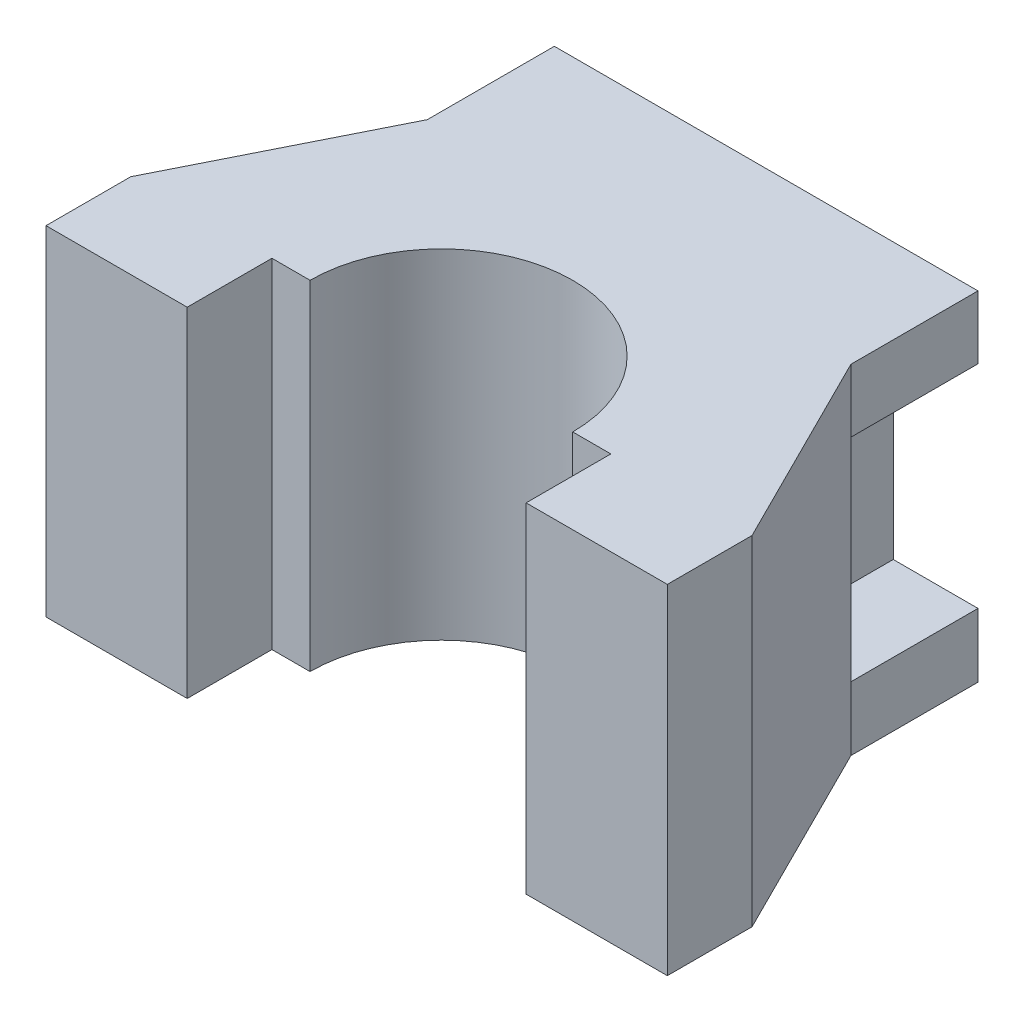
ISO-10303-21;
HEADER;
FILE_DESCRIPTION(('STEP AP214'),'2;1');
FILE_NAME('part.step','',(''),(''),'','','');
FILE_SCHEMA(('AUTOMOTIVE_DESIGN { 1 0 10303 214 1 1 1 1 }'));
ENDSEC;
DATA;
#1=APPLICATION_CONTEXT('core data for automotive mechanical design processes');
#2=APPLICATION_PROTOCOL_DEFINITION('international standard','automotive_design',2000,#1);
#3=PRODUCT_CONTEXT('',#1,'mechanical');
#4=PRODUCT('Part','Part','',(#3));
#5=PRODUCT_RELATED_PRODUCT_CATEGORY('part','',(#4));
#6=PRODUCT_DEFINITION_FORMATION('','',#4);
#7=PRODUCT_DEFINITION_CONTEXT('part definition',#1,'design');
#8=PRODUCT_DEFINITION('design','',#6,#7);
#9=PRODUCT_DEFINITION_SHAPE('','',#8);
#10=(LENGTH_UNIT() NAMED_UNIT(*) SI_UNIT(.MILLI.,.METRE.));
#11=(NAMED_UNIT(*) PLANE_ANGLE_UNIT() SI_UNIT($,.RADIAN.));
#12=(NAMED_UNIT(*) SI_UNIT($,.STERADIAN.) SOLID_ANGLE_UNIT());
#13=UNCERTAINTY_MEASURE_WITH_UNIT(LENGTH_MEASURE(1.E-05),#10,'distance_accuracy_value','');
#14=(GEOMETRIC_REPRESENTATION_CONTEXT(3) GLOBAL_UNCERTAINTY_ASSIGNED_CONTEXT((#13)) GLOBAL_UNIT_ASSIGNED_CONTEXT((#10,
#11,#12)) REPRESENTATION_CONTEXT('',''));
#15=CARTESIAN_POINT('',(0.,0.,0.));
#16=DIRECTION('',(0.,0.,1.));
#17=DIRECTION('',(1.,0.,0.));
#18=AXIS2_PLACEMENT_3D('',#15,#16,#17);
#19=CARTESIAN_POINT('',(-30.,-48.,-40.));
#20=DIRECTION('',(-1.,0.,0.));
#21=DIRECTION('',(0.,0.,1.));
#22=AXIS2_PLACEMENT_3D('',#19,#20,#21);
#23=PLANE('',#22);
#24=DIRECTION('',(0.,1.,0.));
#25=VECTOR('',#24,1.);
#26=CARTESIAN_POINT('',(-30.,-48.,-58.));
#27=LINE('',#26,#25);
#28=CARTESIAN_POINT('',(-30.,-8.94562885867254,-58.));
#29=VERTEX_POINT('',#28);
#30=CARTESIAN_POINT('',(-30.,0.,-58.));
#31=VERTEX_POINT('',#30);
#32=EDGE_CURVE('E340',#29,#31,#27,.T.);
#33=ORIENTED_EDGE('',*,*,#32,.F.);
#34=DIRECTION('',(0.,0.,-1.));
#35=VECTOR('',#34,1.);
#36=CARTESIAN_POINT('',(-30.,-8.94562885867254,-40.));
#37=LINE('',#36,#35);
#38=CARTESIAN_POINT('',(-30.,-8.94562885867254,-40.));
#39=VERTEX_POINT('',#38);
#40=EDGE_CURVE('E223',#39,#29,#37,.T.);
#41=ORIENTED_EDGE('',*,*,#40,.F.);
#42=DIRECTION('',(0.,1.,0.));
#43=VECTOR('',#42,1.);
#44=CARTESIAN_POINT('',(-30.,-48.,-40.));
#45=LINE('',#44,#43);
#46=CARTESIAN_POINT('',(-30.,0.,-40.));
#47=VERTEX_POINT('',#46);
#48=EDGE_CURVE('E336',#39,#47,#45,.T.);
#49=ORIENTED_EDGE('',*,*,#48,.T.);
#50=DIRECTION('',(0.,0.,1.));
#51=VECTOR('',#50,1.);
#52=CARTESIAN_POINT('',(-30.,0.,-40.));
#53=LINE('',#52,#51);
#54=EDGE_CURVE('E329',#31,#47,#53,.T.);
#55=ORIENTED_EDGE('',*,*,#54,.F.);
#56=EDGE_LOOP('',(#33,#41,#49,#55));
#57=FACE_BOUND('',#56,.T.);
#58=ADVANCED_FACE('F39',(#57),#23,.T.);
#59=CARTESIAN_POINT('',(-30.,-48.,-40.));
#60=VERTEX_POINT('',#59);
#61=CARTESIAN_POINT('',(-30.,-38.9456288586725,-40.));
#62=VERTEX_POINT('',#61);
#63=EDGE_CURVE('E48',#60,#62,#45,.T.);
#64=ORIENTED_EDGE('',*,*,#63,.T.);
#65=DIRECTION('',(0.,0.,-1.));
#66=VECTOR('',#65,1.);
#67=CARTESIAN_POINT('',(-30.,-38.9456288586725,-40.));
#68=LINE('',#67,#66);
#69=CARTESIAN_POINT('',(-30.,-38.9456288586725,-58.));
#70=VERTEX_POINT('',#69);
#71=EDGE_CURVE('E196',#62,#70,#68,.T.);
#72=ORIENTED_EDGE('',*,*,#71,.T.);
#73=CARTESIAN_POINT('',(-30.,-48.,-58.));
#74=VERTEX_POINT('',#73);
#75=EDGE_CURVE('E337',#74,#70,#27,.T.);
#76=ORIENTED_EDGE('',*,*,#75,.F.);
#77=DIRECTION('',(0.,0.,1.));
#78=VECTOR('',#77,1.);
#79=CARTESIAN_POINT('',(-30.,-48.,-40.));
#80=LINE('',#79,#78);
#81=EDGE_CURVE('E288',#74,#60,#80,.T.);
#82=ORIENTED_EDGE('',*,*,#81,.T.);
#83=EDGE_LOOP('',(#64,#72,#76,#82));
#84=FACE_BOUND('',#83,.T.);
#85=ADVANCED_FACE('F429',(#84),#23,.T.);
#86=CARTESIAN_POINT('',(-30.,-48.,-58.));
#87=DIRECTION('',(0.,0.,-1.));
#88=DIRECTION('',(-1.,0.,0.));
#89=AXIS2_PLACEMENT_3D('',#86,#87,#88);
#90=PLANE('',#89);
#91=DIRECTION('',(0.,1.,0.));
#92=VECTOR('',#91,1.);
#93=CARTESIAN_POINT('',(-18.,-38.9456288586725,-58.));
#94=LINE('',#93,#92);
#95=CARTESIAN_POINT('',(-18.,-38.9456288586725,-58.));
#96=VERTEX_POINT('',#95);
#97=CARTESIAN_POINT('',(-18.,-8.94562885867254,-58.));
#98=VERTEX_POINT('',#97);
#99=EDGE_CURVE('E56',#96,#98,#94,.T.);
#100=ORIENTED_EDGE('',*,*,#99,.T.);
#101=DIRECTION('',(-1.,0.,0.));
#102=VECTOR('',#101,1.);
#103=CARTESIAN_POINT('',(-30.,-8.94562885867254,-58.));
#104=LINE('',#103,#102);
#105=EDGE_CURVE('E210',#98,#29,#104,.T.);
#106=ORIENTED_EDGE('',*,*,#105,.T.);
#107=ORIENTED_EDGE('',*,*,#32,.T.);
#108=DIRECTION('',(-1.,0.,0.));
#109=VECTOR('',#108,1.);
#110=CARTESIAN_POINT('',(-30.,0.,-58.));
#111=LINE('',#110,#109);
#112=CARTESIAN_POINT('',(30.,0.,-58.));
#113=VERTEX_POINT('',#112);
#114=EDGE_CURVE('E326',#113,#31,#111,.T.);
#115=ORIENTED_EDGE('',*,*,#114,.F.);
#116=DIRECTION('',(0.,1.,0.));
#117=VECTOR('',#116,1.);
#118=CARTESIAN_POINT('',(30.,-48.,-58.));
#119=LINE('',#118,#117);
#120=CARTESIAN_POINT('',(30.,-8.94562885867254,-58.));
#121=VERTEX_POINT('',#120);
#122=EDGE_CURVE('E344',#121,#113,#119,.T.);
#123=ORIENTED_EDGE('',*,*,#122,.F.);
#124=DIRECTION('',(1.,0.,0.));
#125=VECTOR('',#124,1.);
#126=CARTESIAN_POINT('',(30.,-8.94562885867254,-58.));
#127=LINE('',#126,#125);
#128=CARTESIAN_POINT('',(18.,-8.94562885867254,-58.));
#129=VERTEX_POINT('',#128);
#130=EDGE_CURVE('E238',#129,#121,#127,.T.);
#131=ORIENTED_EDGE('',*,*,#130,.F.);
#132=DIRECTION('',(0.,1.,0.));
#133=VECTOR('',#132,1.);
#134=CARTESIAN_POINT('',(18.,-38.9456288586725,-58.));
#135=LINE('',#134,#133);
#136=CARTESIAN_POINT('',(18.,-38.9456288586725,-58.));
#137=VERTEX_POINT('',#136);
#138=EDGE_CURVE('E222',#137,#129,#135,.T.);
#139=ORIENTED_EDGE('',*,*,#138,.F.);
#140=DIRECTION('',(-1.,0.,0.));
#141=VECTOR('',#140,1.);
#142=CARTESIAN_POINT('',(30.,-38.9456288586725,-58.));
#143=LINE('',#142,#141);
#144=CARTESIAN_POINT('',(30.,-38.9456288586725,-58.));
#145=VERTEX_POINT('',#144);
#146=EDGE_CURVE('E228',#145,#137,#143,.T.);
#147=ORIENTED_EDGE('',*,*,#146,.F.);
#148=CARTESIAN_POINT('',(30.,-48.,-58.));
#149=VERTEX_POINT('',#148);
#150=EDGE_CURVE('E341',#149,#145,#119,.T.);
#151=ORIENTED_EDGE('',*,*,#150,.F.);
#152=DIRECTION('',(-1.,0.,0.));
#153=VECTOR('',#152,1.);
#154=CARTESIAN_POINT('',(-30.,-48.,-58.));
#155=LINE('',#154,#153);
#156=EDGE_CURVE('E285',#149,#74,#155,.T.);
#157=ORIENTED_EDGE('',*,*,#156,.T.);
#158=ORIENTED_EDGE('',*,*,#75,.T.);
#159=DIRECTION('',(1.,0.,0.));
#160=VECTOR('',#159,1.);
#161=CARTESIAN_POINT('',(-30.,-38.9456288586725,-58.));
#162=LINE('',#161,#160);
#163=EDGE_CURVE('E213',#70,#96,#162,.T.);
#164=ORIENTED_EDGE('',*,*,#163,.T.);
#165=EDGE_LOOP('',(#100,#106,#107,#115,#123,#131,#139,#147,#151,#157,#158,#164));
#166=FACE_BOUND('',#165,.T.);
#167=ADVANCED_FACE('F422',(#166),#90,.T.);
#168=CARTESIAN_POINT('',(30.,-48.,-58.));
#169=DIRECTION('',(1.,0.,0.));
#170=DIRECTION('',(0.,0.,-1.));
#171=AXIS2_PLACEMENT_3D('',#168,#169,#170);
#172=PLANE('',#171);
#173=DIRECTION('',(0.,0.,-1.));
#174=VECTOR('',#173,1.);
#175=CARTESIAN_POINT('',(30.,-38.9456288586725,-40.));
#176=LINE('',#175,#174);
#177=CARTESIAN_POINT('',(30.,-38.9456288586725,-40.));
#178=VERTEX_POINT('',#177);
#179=EDGE_CURVE('E245',#178,#145,#176,.T.);
#180=ORIENTED_EDGE('',*,*,#179,.F.);
#181=DIRECTION('',(0.,1.,0.));
#182=VECTOR('',#181,1.);
#183=CARTESIAN_POINT('',(30.,-48.,-40.));
#184=LINE('',#183,#182);
#185=CARTESIAN_POINT('',(30.,-48.,-40.));
#186=VERTEX_POINT('',#185);
#187=EDGE_CURVE('E345',#186,#178,#184,.T.);
#188=ORIENTED_EDGE('',*,*,#187,.F.);
#189=DIRECTION('',(0.,0.,-1.));
#190=VECTOR('',#189,1.);
#191=CARTESIAN_POINT('',(30.,-48.,-58.));
#192=LINE('',#191,#190);
#193=EDGE_CURVE('E282',#186,#149,#192,.T.);
#194=ORIENTED_EDGE('',*,*,#193,.T.);
#195=ORIENTED_EDGE('',*,*,#150,.T.);
#196=EDGE_LOOP('',(#180,#188,#194,#195));
#197=FACE_BOUND('',#196,.T.);
#198=ADVANCED_FACE('F436',(#197),#172,.T.);
#199=CARTESIAN_POINT('',(-44.,-48.,0.));
#200=DIRECTION('',(-1.,0.,0.));
#201=DIRECTION('',(0.,0.,1.));
#202=AXIS2_PLACEMENT_3D('',#199,#200,#201);
#203=PLANE('',#202);
#204=DIRECTION('',(0.,0.,1.));
#205=VECTOR('',#204,1.);
#206=CARTESIAN_POINT('',(-44.,0.,0.));
#207=LINE('',#206,#205);
#208=CARTESIAN_POINT('',(-44.,0.,-12.));
#209=VERTEX_POINT('',#208);
#210=CARTESIAN_POINT('',(-44.,0.,0.));
#211=VERTEX_POINT('',#210);
#212=EDGE_CURVE('E244',#209,#211,#207,.T.);
#213=ORIENTED_EDGE('',*,*,#212,.F.);
#214=DIRECTION('',(0.,1.,0.));
#215=VECTOR('',#214,1.);
#216=CARTESIAN_POINT('',(-44.,-48.,-12.));
#217=LINE('',#216,#215);
#218=CARTESIAN_POINT('',(-44.,-48.,-12.));
#219=VERTEX_POINT('',#218);
#220=EDGE_CURVE('E11',#219,#209,#217,.T.);
#221=ORIENTED_EDGE('',*,*,#220,.F.);
#222=DIRECTION('',(0.,0.,1.));
#223=VECTOR('',#222,1.);
#224=CARTESIAN_POINT('',(-44.,-48.,0.));
#225=LINE('',#224,#223);
#226=CARTESIAN_POINT('',(-44.,-48.,0.));
#227=VERTEX_POINT('',#226);
#228=EDGE_CURVE('E251',#219,#227,#225,.T.);
#229=ORIENTED_EDGE('',*,*,#228,.T.);
#230=DIRECTION('',(0.,1.,0.));
#231=VECTOR('',#230,1.);
#232=CARTESIAN_POINT('',(-44.,-48.,0.));
#233=LINE('',#232,#231);
#234=EDGE_CURVE('E43',#227,#211,#233,.T.);
#235=ORIENTED_EDGE('',*,*,#234,.T.);
#236=EDGE_LOOP('',(#213,#221,#229,#235));
#237=FACE_BOUND('',#236,.T.);
#238=ADVANCED_FACE('F41',(#237),#203,.T.);
#239=CARTESIAN_POINT('',(-44.,-48.,-12.));
#240=DIRECTION('',(-0.894427190999916,0.,-0.447213595499958));
#241=DIRECTION('',(-0.447213595499958,0.,0.894427190999916));
#242=AXIS2_PLACEMENT_3D('',#239,#240,#241);
#243=PLANE('',#242);
#244=DIRECTION('',(-0.447213595499958,0.,0.894427190999916));
#245=VECTOR('',#244,1.);
#246=CARTESIAN_POINT('',(-44.,0.,-12.));
#247=LINE('',#246,#245);
#248=EDGE_CURVE('E255',#47,#209,#247,.T.);
#249=ORIENTED_EDGE('',*,*,#248,.F.);
#250=ORIENTED_EDGE('',*,*,#48,.F.);
#251=DIRECTION('',(0.,-1.,0.));
#252=VECTOR('',#251,1.);
#253=CARTESIAN_POINT('',(-30.,-8.94562885867254,-40.));
#254=LINE('',#253,#252);
#255=EDGE_CURVE('E201',#39,#62,#254,.T.);
#256=ORIENTED_EDGE('',*,*,#255,.T.);
#257=ORIENTED_EDGE('',*,*,#63,.F.);
#258=DIRECTION('',(-0.447213595499958,0.,0.894427190999916));
#259=VECTOR('',#258,1.);
#260=CARTESIAN_POINT('',(-44.,-48.,-12.));
#261=LINE('',#260,#259);
#262=EDGE_CURVE('E291',#60,#219,#261,.T.);
#263=ORIENTED_EDGE('',*,*,#262,.T.);
#264=ORIENTED_EDGE('',*,*,#220,.T.);
#265=EDGE_LOOP('',(#249,#250,#256,#257,#263,#264));
#266=FACE_BOUND('',#265,.T.);
#267=ADVANCED_FACE('F377',(#266),#243,.T.);
#268=DIRECTION('',(0.,0.,-1.));
#269=VECTOR('',#268,1.);
#270=CARTESIAN_POINT('',(30.,-8.94562885867254,-40.));
#271=LINE('',#270,#269);
#272=CARTESIAN_POINT('',(30.,-8.94562885867254,-40.));
#273=VERTEX_POINT('',#272);
#274=EDGE_CURVE('E247',#273,#121,#271,.T.);
#275=ORIENTED_EDGE('',*,*,#274,.T.);
#276=ORIENTED_EDGE('',*,*,#122,.T.);
#277=DIRECTION('',(0.,0.,-1.));
#278=VECTOR('',#277,1.);
#279=CARTESIAN_POINT('',(30.,0.,-58.));
#280=LINE('',#279,#278);
#281=CARTESIAN_POINT('',(30.,0.,-40.));
#282=VERTEX_POINT('',#281);
#283=EDGE_CURVE('E323',#282,#113,#280,.T.);
#284=ORIENTED_EDGE('',*,*,#283,.F.);
#285=EDGE_CURVE('E348',#273,#282,#184,.T.);
#286=ORIENTED_EDGE('',*,*,#285,.F.);
#287=EDGE_LOOP('',(#275,#276,#284,#286));
#288=FACE_BOUND('',#287,.T.);
#289=ADVANCED_FACE('F417',(#288),#172,.T.);
#290=CARTESIAN_POINT('',(30.,-48.,-40.));
#291=DIRECTION('',(0.894427190999916,0.,-0.447213595499958));
#292=DIRECTION('',(-0.447213595499958,0.,-0.894427190999916));
#293=AXIS2_PLACEMENT_3D('',#290,#291,#292);
#294=PLANE('',#293);
#295=DIRECTION('',(-0.447213595499958,0.,-0.894427190999916));
#296=VECTOR('',#295,1.);
#297=CARTESIAN_POINT('',(30.,0.,-40.));
#298=LINE('',#297,#296);
#299=CARTESIAN_POINT('',(44.,0.,-12.));
#300=VERTEX_POINT('',#299);
#301=EDGE_CURVE('E320',#300,#282,#298,.T.);
#302=ORIENTED_EDGE('',*,*,#301,.F.);
#303=DIRECTION('',(0.,1.,0.));
#304=VECTOR('',#303,1.);
#305=CARTESIAN_POINT('',(44.,-48.,-12.));
#306=LINE('',#305,#304);
#307=CARTESIAN_POINT('',(44.,-48.,-12.));
#308=VERTEX_POINT('',#307);
#309=EDGE_CURVE('E349',#308,#300,#306,.T.);
#310=ORIENTED_EDGE('',*,*,#309,.F.);
#311=DIRECTION('',(-0.447213595499958,0.,-0.894427190999916));
#312=VECTOR('',#311,1.);
#313=CARTESIAN_POINT('',(30.,-48.,-40.));
#314=LINE('',#313,#312);
#315=EDGE_CURVE('E279',#308,#186,#314,.T.);
#316=ORIENTED_EDGE('',*,*,#315,.T.);
#317=ORIENTED_EDGE('',*,*,#187,.T.);
#318=DIRECTION('',(0.,-1.,0.));
#319=VECTOR('',#318,1.);
#320=CARTESIAN_POINT('',(30.,-8.94562885867254,-40.));
#321=LINE('',#320,#319);
#322=EDGE_CURVE('E230',#273,#178,#321,.T.);
#323=ORIENTED_EDGE('',*,*,#322,.F.);
#324=ORIENTED_EDGE('',*,*,#285,.T.);
#325=EDGE_LOOP('',(#302,#310,#316,#317,#323,#324));
#326=FACE_BOUND('',#325,.T.);
#327=ADVANCED_FACE('F412',(#326),#294,.T.);
#328=CARTESIAN_POINT('',(44.,-48.,0.));
#329=DIRECTION('',(1.,0.,0.));
#330=DIRECTION('',(0.,0.,-1.));
#331=AXIS2_PLACEMENT_3D('',#328,#329,#330);
#332=PLANE('',#331);
#333=DIRECTION('',(0.,0.,-1.));
#334=VECTOR('',#333,1.);
#335=CARTESIAN_POINT('',(44.,0.,0.));
#336=LINE('',#335,#334);
#337=CARTESIAN_POINT('',(44.,0.,0.));
#338=VERTEX_POINT('',#337);
#339=EDGE_CURVE('E317',#338,#300,#336,.T.);
#340=ORIENTED_EDGE('',*,*,#339,.F.);
#341=DIRECTION('',(0.,1.,0.));
#342=VECTOR('',#341,1.);
#343=CARTESIAN_POINT('',(44.,-48.,0.));
#344=LINE('',#343,#342);
#345=CARTESIAN_POINT('',(44.,-48.,0.));
#346=VERTEX_POINT('',#345);
#347=EDGE_CURVE('E351',#346,#338,#344,.T.);
#348=ORIENTED_EDGE('',*,*,#347,.F.);
#349=DIRECTION('',(0.,0.,-1.));
#350=VECTOR('',#349,1.);
#351=CARTESIAN_POINT('',(44.,-48.,0.));
#352=LINE('',#351,#350);
#353=EDGE_CURVE('E276',#346,#308,#352,.T.);
#354=ORIENTED_EDGE('',*,*,#353,.T.);
#355=ORIENTED_EDGE('',*,*,#309,.T.);
#356=EDGE_LOOP('',(#340,#348,#354,#355));
#357=FACE_BOUND('',#356,.T.);
#358=ADVANCED_FACE('F408',(#357),#332,.T.);
#359=CARTESIAN_POINT('',(44.,-48.,0.));
#360=DIRECTION('',(0.,0.,1.));
#361=DIRECTION('',(1.,0.,0.));
#362=AXIS2_PLACEMENT_3D('',#359,#360,#361);
#363=PLANE('',#362);
#364=DIRECTION('',(1.,0.,0.));
#365=VECTOR('',#364,1.);
#366=CARTESIAN_POINT('',(44.,0.,0.));
#367=LINE('',#366,#365);
#368=CARTESIAN_POINT('',(24.,0.,0.));
#369=VERTEX_POINT('',#368);
#370=EDGE_CURVE('E314',#369,#338,#367,.T.);
#371=ORIENTED_EDGE('',*,*,#370,.F.);
#372=DIRECTION('',(0.,1.,0.));
#373=VECTOR('',#372,1.);
#374=CARTESIAN_POINT('',(24.,-48.,0.));
#375=LINE('',#374,#373);
#376=CARTESIAN_POINT('',(24.,-48.,0.));
#377=VERTEX_POINT('',#376);
#378=EDGE_CURVE('E353',#377,#369,#375,.T.);
#379=ORIENTED_EDGE('',*,*,#378,.F.);
#380=DIRECTION('',(1.,0.,0.));
#381=VECTOR('',#380,1.);
#382=CARTESIAN_POINT('',(44.,-48.,0.));
#383=LINE('',#382,#381);
#384=EDGE_CURVE('E273',#377,#346,#383,.T.);
#385=ORIENTED_EDGE('',*,*,#384,.T.);
#386=ORIENTED_EDGE('',*,*,#347,.T.);
#387=EDGE_LOOP('',(#371,#379,#385,#386));
#388=FACE_BOUND('',#387,.T.);
#389=ADVANCED_FACE('F404',(#388),#363,.T.);
#390=CARTESIAN_POINT('',(24.,-48.,0.));
#391=DIRECTION('',(-1.,0.,0.));
#392=DIRECTION('',(0.,0.,1.));
#393=AXIS2_PLACEMENT_3D('',#390,#391,#392);
#394=PLANE('',#393);
#395=DIRECTION('',(0.,0.,1.));
#396=VECTOR('',#395,1.);
#397=CARTESIAN_POINT('',(24.,0.,0.));
#398=LINE('',#397,#396);
#399=CARTESIAN_POINT('',(24.,0.,-12.));
#400=VERTEX_POINT('',#399);
#401=EDGE_CURVE('E311',#400,#369,#398,.T.);
#402=ORIENTED_EDGE('',*,*,#401,.F.);
#403=DIRECTION('',(0.,1.,0.));
#404=VECTOR('',#403,1.);
#405=CARTESIAN_POINT('',(24.,-48.,-12.));
#406=LINE('',#405,#404);
#407=CARTESIAN_POINT('',(24.,-48.,-12.));
#408=VERTEX_POINT('',#407);
#409=EDGE_CURVE('E355',#408,#400,#406,.T.);
#410=ORIENTED_EDGE('',*,*,#409,.F.);
#411=DIRECTION('',(0.,0.,1.));
#412=VECTOR('',#411,1.);
#413=CARTESIAN_POINT('',(24.,-48.,0.));
#414=LINE('',#413,#412);
#415=EDGE_CURVE('E270',#408,#377,#414,.T.);
#416=ORIENTED_EDGE('',*,*,#415,.T.);
#417=ORIENTED_EDGE('',*,*,#378,.T.);
#418=EDGE_LOOP('',(#402,#410,#416,#417));
#419=FACE_BOUND('',#418,.T.);
#420=ADVANCED_FACE('F400',(#419),#394,.T.);
#421=CARTESIAN_POINT('',(24.,-48.,-12.));
#422=DIRECTION('',(0.,0.,1.));
#423=DIRECTION('',(1.,0.,0.));
#424=AXIS2_PLACEMENT_3D('',#421,#422,#423);
#425=PLANE('',#424);
#426=DIRECTION('',(1.,0.,0.));
#427=VECTOR('',#426,1.);
#428=CARTESIAN_POINT('',(24.,0.,-12.));
#429=LINE('',#428,#427);
#430=CARTESIAN_POINT('',(18.6018408606082,0.,-12.));
#431=VERTEX_POINT('',#430);
#432=EDGE_CURVE('E308',#431,#400,#429,.T.);
#433=ORIENTED_EDGE('',*,*,#432,.F.);
#434=DIRECTION('',(0.,1.,0.));
#435=VECTOR('',#434,1.);
#436=CARTESIAN_POINT('',(18.6018408606082,-48.,-12.));
#437=LINE('',#436,#435);
#438=CARTESIAN_POINT('',(18.6018408606082,-48.,-12.));
#439=VERTEX_POINT('',#438);
#440=EDGE_CURVE('E357',#439,#431,#437,.T.);
#441=ORIENTED_EDGE('',*,*,#440,.F.);
#442=DIRECTION('',(1.,0.,0.));
#443=VECTOR('',#442,1.);
#444=CARTESIAN_POINT('',(24.,-48.,-12.));
#445=LINE('',#444,#443);
#446=EDGE_CURVE('E267',#439,#408,#445,.T.);
#447=ORIENTED_EDGE('',*,*,#446,.T.);
#448=ORIENTED_EDGE('',*,*,#409,.T.);
#449=EDGE_LOOP('',(#433,#441,#447,#448));
#450=FACE_BOUND('',#449,.T.);
#451=ADVANCED_FACE('F396',(#450),#425,.T.);
#452=CARTESIAN_POINT('',(0.,-48.,-12.));
#453=DIRECTION('',(0.,1.,0.));
#454=DIRECTION('',(0.,0.,1.));
#455=AXIS2_PLACEMENT_3D('',#452,#453,#454);
#456=CYLINDRICAL_SURFACE('',#455,18.6018408606082);
#457=CARTESIAN_POINT('',(0.,0.,-12.));
#458=DIRECTION('',(0.,-1.,0.));
#459=DIRECTION('',(0.,0.,1.));
#460=AXIS2_PLACEMENT_3D('',#457,#458,#459);
#461=CIRCLE('',#460,18.6018408606082);
#462=CARTESIAN_POINT('',(-18.6018408606082,0.,-12.));
#463=VERTEX_POINT('',#462);
#464=EDGE_CURVE('E305',#463,#431,#461,.T.);
#465=ORIENTED_EDGE('',*,*,#464,.F.);
#466=DIRECTION('',(0.,1.,0.));
#467=VECTOR('',#466,1.);
#468=CARTESIAN_POINT('',(-18.6018408606082,-48.,-12.));
#469=LINE('',#468,#467);
#470=CARTESIAN_POINT('',(-18.6018408606082,-48.,-12.));
#471=VERTEX_POINT('',#470);
#472=EDGE_CURVE('E359',#471,#463,#469,.T.);
#473=ORIENTED_EDGE('',*,*,#472,.F.);
#474=CARTESIAN_POINT('',(0.,-48.,-12.));
#475=DIRECTION('',(0.,-1.,0.));
#476=DIRECTION('',(0.,0.,1.));
#477=AXIS2_PLACEMENT_3D('',#474,#475,#476);
#478=CIRCLE('',#477,18.6018408606082);
#479=EDGE_CURVE('E264',#471,#439,#478,.T.);
#480=ORIENTED_EDGE('',*,*,#479,.T.);
#481=ORIENTED_EDGE('',*,*,#440,.T.);
#482=EDGE_LOOP('',(#465,#473,#480,#481));
#483=FACE_BOUND('',#482,.T.);
#484=ADVANCED_FACE('F392',(#483),#456,.F.);
#485=CARTESIAN_POINT('',(-24.,-48.,-12.));
#486=DIRECTION('',(0.,0.,1.));
#487=DIRECTION('',(1.,0.,0.));
#488=AXIS2_PLACEMENT_3D('',#485,#486,#487);
#489=PLANE('',#488);
#490=DIRECTION('',(1.,0.,0.));
#491=VECTOR('',#490,1.);
#492=CARTESIAN_POINT('',(-24.,0.,-12.));
#493=LINE('',#492,#491);
#494=CARTESIAN_POINT('',(-24.,0.,-12.));
#495=VERTEX_POINT('',#494);
#496=EDGE_CURVE('E302',#495,#463,#493,.T.);
#497=ORIENTED_EDGE('',*,*,#496,.F.);
#498=DIRECTION('',(0.,1.,0.));
#499=VECTOR('',#498,1.);
#500=CARTESIAN_POINT('',(-24.,-48.,-12.));
#501=LINE('',#500,#499);
#502=CARTESIAN_POINT('',(-24.,-48.,-12.));
#503=VERTEX_POINT('',#502);
#504=EDGE_CURVE('E361',#503,#495,#501,.T.);
#505=ORIENTED_EDGE('',*,*,#504,.F.);
#506=DIRECTION('',(1.,0.,0.));
#507=VECTOR('',#506,1.);
#508=CARTESIAN_POINT('',(-24.,-48.,-12.));
#509=LINE('',#508,#507);
#510=EDGE_CURVE('E261',#503,#471,#509,.T.);
#511=ORIENTED_EDGE('',*,*,#510,.T.);
#512=ORIENTED_EDGE('',*,*,#472,.T.);
#513=EDGE_LOOP('',(#497,#505,#511,#512));
#514=FACE_BOUND('',#513,.T.);
#515=ADVANCED_FACE('F390',(#514),#489,.T.);
#516=CARTESIAN_POINT('',(-24.,-48.,0.));
#517=DIRECTION('',(1.,0.,0.));
#518=DIRECTION('',(0.,0.,-1.));
#519=AXIS2_PLACEMENT_3D('',#516,#517,#518);
#520=PLANE('',#519);
#521=DIRECTION('',(0.,0.,-1.));
#522=VECTOR('',#521,1.);
#523=CARTESIAN_POINT('',(-24.,0.,0.));
#524=LINE('',#523,#522);
#525=CARTESIAN_POINT('',(-24.,0.,0.));
#526=VERTEX_POINT('',#525);
#527=EDGE_CURVE('E299',#526,#495,#524,.T.);
#528=ORIENTED_EDGE('',*,*,#527,.F.);
#529=DIRECTION('',(0.,1.,0.));
#530=VECTOR('',#529,1.);
#531=CARTESIAN_POINT('',(-24.,-48.,0.));
#532=LINE('',#531,#530);
#533=CARTESIAN_POINT('',(-24.,-48.,0.));
#534=VERTEX_POINT('',#533);
#535=EDGE_CURVE('E362',#534,#526,#532,.T.);
#536=ORIENTED_EDGE('',*,*,#535,.F.);
#537=DIRECTION('',(0.,0.,-1.));
#538=VECTOR('',#537,1.);
#539=CARTESIAN_POINT('',(-24.,-48.,0.));
#540=LINE('',#539,#538);
#541=EDGE_CURVE('E258',#534,#503,#540,.T.);
#542=ORIENTED_EDGE('',*,*,#541,.T.);
#543=ORIENTED_EDGE('',*,*,#504,.T.);
#544=EDGE_LOOP('',(#528,#536,#542,#543));
#545=FACE_BOUND('',#544,.T.);
#546=ADVANCED_FACE('F386',(#545),#520,.T.);
#547=CARTESIAN_POINT('',(-44.,-48.,0.));
#548=DIRECTION('',(0.,0.,1.));
#549=DIRECTION('',(1.,0.,0.));
#550=AXIS2_PLACEMENT_3D('',#547,#548,#549);
#551=PLANE('',#550);
#552=DIRECTION('',(1.,0.,0.));
#553=VECTOR('',#552,1.);
#554=CARTESIAN_POINT('',(-44.,0.,0.));
#555=LINE('',#554,#553);
#556=EDGE_CURVE('E296',#211,#526,#555,.T.);
#557=ORIENTED_EDGE('',*,*,#556,.F.);
#558=ORIENTED_EDGE('',*,*,#234,.F.);
#559=DIRECTION('',(1.,0.,0.));
#560=VECTOR('',#559,1.);
#561=CARTESIAN_POINT('',(-44.,-48.,0.));
#562=LINE('',#561,#560);
#563=EDGE_CURVE('E254',#227,#534,#562,.T.);
#564=ORIENTED_EDGE('',*,*,#563,.T.);
#565=ORIENTED_EDGE('',*,*,#535,.T.);
#566=EDGE_LOOP('',(#557,#558,#564,#565));
#567=FACE_BOUND('',#566,.T.);
#568=ADVANCED_FACE('F370',(#567),#551,.T.);
#569=CARTESIAN_POINT('',(0.,-48.,-12.));
#570=DIRECTION('',(0.,1.,0.));
#571=DIRECTION('',(0.,0.,1.));
#572=AXIS2_PLACEMENT_3D('',#569,#570,#571);
#573=PLANE('',#572);
#574=ORIENTED_EDGE('',*,*,#228,.F.);
#575=ORIENTED_EDGE('',*,*,#262,.F.);
#576=ORIENTED_EDGE('',*,*,#81,.F.);
#577=ORIENTED_EDGE('',*,*,#156,.F.);
#578=ORIENTED_EDGE('',*,*,#193,.F.);
#579=ORIENTED_EDGE('',*,*,#315,.F.);
#580=ORIENTED_EDGE('',*,*,#353,.F.);
#581=ORIENTED_EDGE('',*,*,#384,.F.);
#582=ORIENTED_EDGE('',*,*,#415,.F.);
#583=ORIENTED_EDGE('',*,*,#446,.F.);
#584=ORIENTED_EDGE('',*,*,#479,.F.);
#585=ORIENTED_EDGE('',*,*,#510,.F.);
#586=ORIENTED_EDGE('',*,*,#541,.F.);
#587=ORIENTED_EDGE('',*,*,#563,.F.);
#588=EDGE_LOOP('',(#574,#575,#576,#577,#578,#579,#580,#581,#582,#583,#584,#585,#586,#587));
#589=FACE_BOUND('',#588,.T.);
#590=ADVANCED_FACE('F380',(#589),#573,.F.);
#591=CARTESIAN_POINT('',(0.,0.,-12.));
#592=DIRECTION('',(0.,1.,0.));
#593=DIRECTION('',(0.,0.,1.));
#594=AXIS2_PLACEMENT_3D('',#591,#592,#593);
#595=PLANE('',#594);
#596=ORIENTED_EDGE('',*,*,#212,.T.);
#597=ORIENTED_EDGE('',*,*,#556,.T.);
#598=ORIENTED_EDGE('',*,*,#527,.T.);
#599=ORIENTED_EDGE('',*,*,#496,.T.);
#600=ORIENTED_EDGE('',*,*,#464,.T.);
#601=ORIENTED_EDGE('',*,*,#432,.T.);
#602=ORIENTED_EDGE('',*,*,#401,.T.);
#603=ORIENTED_EDGE('',*,*,#370,.T.);
#604=ORIENTED_EDGE('',*,*,#339,.T.);
#605=ORIENTED_EDGE('',*,*,#301,.T.);
#606=ORIENTED_EDGE('',*,*,#283,.T.);
#607=ORIENTED_EDGE('',*,*,#114,.T.);
#608=ORIENTED_EDGE('',*,*,#54,.T.);
#609=ORIENTED_EDGE('',*,*,#248,.T.);
#610=EDGE_LOOP('',(#596,#597,#598,#599,#600,#601,#602,#603,#604,#605,#606,#607,#608,#609));
#611=FACE_BOUND('',#610,.T.);
#612=ADVANCED_FACE('F372',(#611),#595,.T.);
#613=CARTESIAN_POINT('',(18.,-38.9456288586725,-40.));
#614=DIRECTION('',(-1.,0.,0.));
#615=DIRECTION('',(0.,0.,1.));
#616=AXIS2_PLACEMENT_3D('',#613,#614,#615);
#617=PLANE('',#616);
#618=ORIENTED_EDGE('',*,*,#138,.T.);
#619=DIRECTION('',(0.,0.,-1.));
#620=VECTOR('',#619,1.);
#621=CARTESIAN_POINT('',(18.,-8.94562885867254,-40.));
#622=LINE('',#621,#620);
#623=CARTESIAN_POINT('',(18.,-8.94562885867254,-40.));
#624=VERTEX_POINT('',#623);
#625=EDGE_CURVE('E235',#624,#129,#622,.T.);
#626=ORIENTED_EDGE('',*,*,#625,.F.);
#627=DIRECTION('',(0.,1.,0.));
#628=VECTOR('',#627,1.);
#629=CARTESIAN_POINT('',(18.,-38.9456288586725,-40.));
#630=LINE('',#629,#628);
#631=CARTESIAN_POINT('',(18.,-38.9456288586725,-40.));
#632=VERTEX_POINT('',#631);
#633=EDGE_CURVE('E226',#632,#624,#630,.T.);
#634=ORIENTED_EDGE('',*,*,#633,.F.);
#635=DIRECTION('',(0.,0.,-1.));
#636=VECTOR('',#635,1.);
#637=CARTESIAN_POINT('',(18.,-38.9456288586725,-40.));
#638=LINE('',#637,#636);
#639=EDGE_CURVE('E242',#632,#137,#638,.T.);
#640=ORIENTED_EDGE('',*,*,#639,.T.);
#641=EDGE_LOOP('',(#618,#626,#634,#640));
#642=FACE_BOUND('',#641,.T.);
#643=ADVANCED_FACE('F443',(#642),#617,.F.);
#644=CARTESIAN_POINT('',(30.,-38.9456288586725,-40.));
#645=DIRECTION('',(0.,-1.,0.));
#646=DIRECTION('',(0.,0.,-1.));
#647=AXIS2_PLACEMENT_3D('',#644,#645,#646);
#648=PLANE('',#647);
#649=ORIENTED_EDGE('',*,*,#146,.T.);
#650=ORIENTED_EDGE('',*,*,#639,.F.);
#651=DIRECTION('',(-1.,0.,0.));
#652=VECTOR('',#651,1.);
#653=CARTESIAN_POINT('',(30.,-38.9456288586725,-40.));
#654=LINE('',#653,#652);
#655=EDGE_CURVE('E232',#178,#632,#654,.T.);
#656=ORIENTED_EDGE('',*,*,#655,.F.);
#657=ORIENTED_EDGE('',*,*,#179,.T.);
#658=EDGE_LOOP('',(#649,#650,#656,#657));
#659=FACE_BOUND('',#658,.T.);
#660=ADVANCED_FACE('F439',(#659),#648,.F.);
#661=CARTESIAN_POINT('',(30.,-8.94562885867254,-40.));
#662=DIRECTION('',(0.,1.,0.));
#663=DIRECTION('',(0.,0.,1.));
#664=AXIS2_PLACEMENT_3D('',#661,#662,#663);
#665=PLANE('',#664);
#666=ORIENTED_EDGE('',*,*,#130,.T.);
#667=ORIENTED_EDGE('',*,*,#274,.F.);
#668=DIRECTION('',(1.,0.,0.));
#669=VECTOR('',#668,1.);
#670=CARTESIAN_POINT('',(30.,-8.94562885867254,-40.));
#671=LINE('',#670,#669);
#672=EDGE_CURVE('E64',#624,#273,#671,.T.);
#673=ORIENTED_EDGE('',*,*,#672,.F.);
#674=ORIENTED_EDGE('',*,*,#625,.T.);
#675=EDGE_LOOP('',(#666,#667,#673,#674));
#676=FACE_BOUND('',#675,.T.);
#677=ADVANCED_FACE('F445',(#676),#665,.F.);
#678=CARTESIAN_POINT('',(0.,0.,-40.));
#679=DIRECTION('',(0.,0.,1.));
#680=DIRECTION('',(1.,0.,0.));
#681=AXIS2_PLACEMENT_3D('',#678,#679,#680);
#682=PLANE('',#681);
#683=ORIENTED_EDGE('',*,*,#633,.T.);
#684=ORIENTED_EDGE('',*,*,#672,.T.);
#685=ORIENTED_EDGE('',*,*,#322,.T.);
#686=ORIENTED_EDGE('',*,*,#655,.T.);
#687=EDGE_LOOP('',(#683,#684,#685,#686));
#688=FACE_BOUND('',#687,.T.);
#689=ADVANCED_FACE('F441',(#688),#682,.F.);
#690=CARTESIAN_POINT('',(-18.,-38.9456288586725,-40.));
#691=DIRECTION('',(-1.,0.,0.));
#692=DIRECTION('',(0.,0.,1.));
#693=AXIS2_PLACEMENT_3D('',#690,#691,#692);
#694=PLANE('',#693);
#695=ORIENTED_EDGE('',*,*,#99,.F.);
#696=DIRECTION('',(0.,0.,-1.));
#697=VECTOR('',#696,1.);
#698=CARTESIAN_POINT('',(-18.,-38.9456288586725,-40.));
#699=LINE('',#698,#697);
#700=CARTESIAN_POINT('',(-18.,-38.9456288586725,-40.));
#701=VERTEX_POINT('',#700);
#702=EDGE_CURVE('E193',#701,#96,#699,.T.);
#703=ORIENTED_EDGE('',*,*,#702,.F.);
#704=DIRECTION('',(0.,1.,0.));
#705=VECTOR('',#704,1.);
#706=CARTESIAN_POINT('',(-18.,-38.9456288586725,-40.));
#707=LINE('',#706,#705);
#708=CARTESIAN_POINT('',(-18.,-8.94562885867254,-40.));
#709=VERTEX_POINT('',#708);
#710=EDGE_CURVE('E202',#701,#709,#707,.T.);
#711=ORIENTED_EDGE('',*,*,#710,.T.);
#712=DIRECTION('',(0.,0.,-1.));
#713=VECTOR('',#712,1.);
#714=CARTESIAN_POINT('',(-18.,-8.94562885867254,-40.));
#715=LINE('',#714,#713);
#716=EDGE_CURVE('E220',#709,#98,#715,.T.);
#717=ORIENTED_EDGE('',*,*,#716,.T.);
#718=EDGE_LOOP('',(#695,#703,#711,#717));
#719=FACE_BOUND('',#718,.T.);
#720=ADVANCED_FACE('F205',(#719),#694,.T.);
#721=CARTESIAN_POINT('',(-30.,-8.94562885867254,-40.));
#722=DIRECTION('',(0.,-1.,0.));
#723=DIRECTION('',(0.,0.,-1.));
#724=AXIS2_PLACEMENT_3D('',#721,#722,#723);
#725=PLANE('',#724);
#726=ORIENTED_EDGE('',*,*,#105,.F.);
#727=ORIENTED_EDGE('',*,*,#716,.F.);
#728=DIRECTION('',(-1.,0.,0.));
#729=VECTOR('',#728,1.);
#730=CARTESIAN_POINT('',(-30.,-8.94562885867254,-40.));
#731=LINE('',#730,#729);
#732=EDGE_CURVE('E207',#709,#39,#731,.T.);
#733=ORIENTED_EDGE('',*,*,#732,.T.);
#734=ORIENTED_EDGE('',*,*,#40,.T.);
#735=EDGE_LOOP('',(#726,#727,#733,#734));
#736=FACE_BOUND('',#735,.T.);
#737=ADVANCED_FACE('F427',(#736),#725,.T.);
#738=CARTESIAN_POINT('',(-30.,-38.9456288586725,-40.));
#739=DIRECTION('',(0.,1.,0.));
#740=DIRECTION('',(0.,0.,1.));
#741=AXIS2_PLACEMENT_3D('',#738,#739,#740);
#742=PLANE('',#741);
#743=ORIENTED_EDGE('',*,*,#163,.F.);
#744=ORIENTED_EDGE('',*,*,#71,.F.);
#745=DIRECTION('',(1.,0.,0.));
#746=VECTOR('',#745,1.);
#747=CARTESIAN_POINT('',(-30.,-38.9456288586725,-40.));
#748=LINE('',#747,#746);
#749=EDGE_CURVE('E191',#62,#701,#748,.T.);
#750=ORIENTED_EDGE('',*,*,#749,.T.);
#751=ORIENTED_EDGE('',*,*,#702,.T.);
#752=EDGE_LOOP('',(#743,#744,#750,#751));
#753=FACE_BOUND('',#752,.T.);
#754=ADVANCED_FACE('F192',(#753),#742,.T.);
#755=CARTESIAN_POINT('',(0.,0.,-40.));
#756=DIRECTION('',(0.,0.,1.));
#757=DIRECTION('',(-1.,0.,0.));
#758=AXIS2_PLACEMENT_3D('',#755,#756,#757);
#759=PLANE('',#758);
#760=ORIENTED_EDGE('',*,*,#710,.F.);
#761=ORIENTED_EDGE('',*,*,#749,.F.);
#762=ORIENTED_EDGE('',*,*,#255,.F.);
#763=ORIENTED_EDGE('',*,*,#732,.F.);
#764=EDGE_LOOP('',(#760,#761,#762,#763));
#765=FACE_BOUND('',#764,.T.);
#766=ADVANCED_FACE('F209',(#765),#759,.F.);
#767=CLOSED_SHELL('',(#58,#85,#167,#198,#238,#267,#289,#327,#358,#389,#420,#451,#484,#515,#546,
#568,#590,#612,#643,#660,#677,#689,#720,#737,#754,#766));
#768=MANIFOLD_SOLID_BREP('B2',#767);
#769=ADVANCED_BREP_SHAPE_REPRESENTATION('',(#18,#768),#14);
#770=SHAPE_DEFINITION_REPRESENTATION(#9,#769);
ENDSEC;
END-ISO-10303-21;
